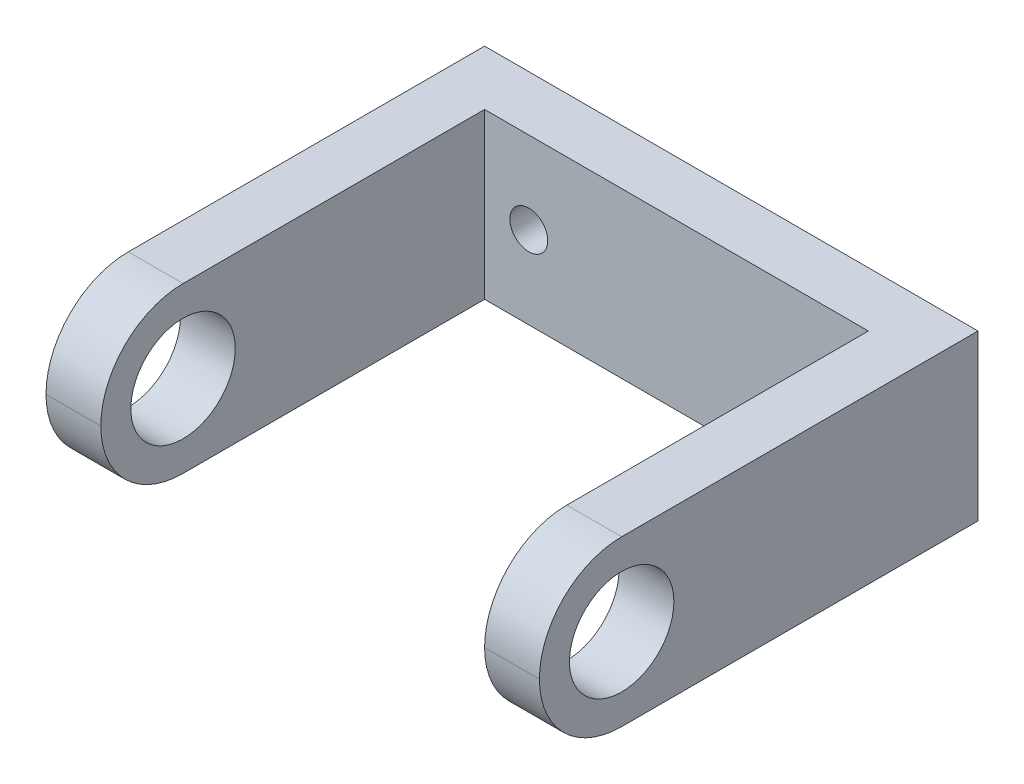
ISO-10303-21;
HEADER;
FILE_DESCRIPTION(('STEP AP214'),'2;1');
FILE_NAME('part.step','',(''),(''),'','','');
FILE_SCHEMA(('AUTOMOTIVE_DESIGN { 1 0 10303 214 1 1 1 1 }'));
ENDSEC;
DATA;
#1=APPLICATION_CONTEXT('core data for automotive mechanical design processes');
#2=APPLICATION_PROTOCOL_DEFINITION('international standard','automotive_design',2000,#1);
#3=PRODUCT_CONTEXT('',#1,'mechanical');
#4=PRODUCT('Part','Part','',(#3));
#5=PRODUCT_RELATED_PRODUCT_CATEGORY('part','',(#4));
#6=PRODUCT_DEFINITION_FORMATION('','',#4);
#7=PRODUCT_DEFINITION_CONTEXT('part definition',#1,'design');
#8=PRODUCT_DEFINITION('design','',#6,#7);
#9=PRODUCT_DEFINITION_SHAPE('','',#8);
#10=(LENGTH_UNIT() NAMED_UNIT(*) SI_UNIT(.MILLI.,.METRE.));
#11=(NAMED_UNIT(*) PLANE_ANGLE_UNIT() SI_UNIT($,.RADIAN.));
#12=(NAMED_UNIT(*) SI_UNIT($,.STERADIAN.) SOLID_ANGLE_UNIT());
#13=UNCERTAINTY_MEASURE_WITH_UNIT(LENGTH_MEASURE(1.E-05),#10,'distance_accuracy_value','');
#14=(GEOMETRIC_REPRESENTATION_CONTEXT(3) GLOBAL_UNCERTAINTY_ASSIGNED_CONTEXT((#13)) GLOBAL_UNIT_ASSIGNED_CONTEXT((#10,
#11,#12)) REPRESENTATION_CONTEXT('',''));
#15=CARTESIAN_POINT('',(0.,0.,0.));
#16=DIRECTION('',(0.,0.,1.));
#17=DIRECTION('',(1.,0.,0.));
#18=AXIS2_PLACEMENT_3D('',#15,#16,#17);
#19=CARTESIAN_POINT('',(-17.5,7.5,-27.5));
#20=DIRECTION('',(-1.,0.,0.));
#21=DIRECTION('',(0.,0.,1.));
#22=AXIS2_PLACEMENT_3D('',#19,#20,#21);
#23=PLANE('',#22);
#24=CARTESIAN_POINT('',(-17.5,0.,0.));
#25=DIRECTION('',(-1.,0.,0.));
#26=DIRECTION('',(0.,0.,1.));
#27=AXIS2_PLACEMENT_3D('',#24,#25,#26);
#28=CIRCLE('',#27,4.7625);
#29=CARTESIAN_POINT('',(-17.5,0.,-4.7625));
#30=VERTEX_POINT('',#29);
#31=EDGE_CURVE('E237',#30,#30,#28,.T.);
#32=ORIENTED_EDGE('',*,*,#31,.T.);
#33=EDGE_LOOP('',(#32));
#34=FACE_BOUND('',#33,.T.);
#35=CARTESIAN_POINT('',(-17.5,0.,0.));
#36=DIRECTION('',(-1.,0.,0.));
#37=DIRECTION('',(0.,0.,1.));
#38=AXIS2_PLACEMENT_3D('',#35,#36,#37);
#39=CIRCLE('',#38,7.5);
#40=CARTESIAN_POINT('',(-17.5,7.5,0.));
#41=VERTEX_POINT('',#40);
#42=CARTESIAN_POINT('',(-17.5,0.,7.5));
#43=VERTEX_POINT('',#42);
#44=EDGE_CURVE('E72',#41,#43,#39,.F.);
#45=ORIENTED_EDGE('',*,*,#44,.T.);
#46=CARTESIAN_POINT('',(-17.5,0.,0.));
#47=DIRECTION('',(-1.,0.,0.));
#48=DIRECTION('',(0.,0.,1.));
#49=AXIS2_PLACEMENT_3D('',#46,#47,#48);
#50=CIRCLE('',#49,7.5);
#51=CARTESIAN_POINT('',(-17.5,-7.5,0.));
#52=VERTEX_POINT('',#51);
#53=EDGE_CURVE('E198',#43,#52,#50,.F.);
#54=ORIENTED_EDGE('',*,*,#53,.T.);
#55=DIRECTION('',(0.,0.,-1.));
#56=VECTOR('',#55,1.);
#57=CARTESIAN_POINT('',(-17.5,-7.5,-27.5));
#58=LINE('',#57,#56);
#59=CARTESIAN_POINT('',(-17.5,-7.5,-27.5));
#60=VERTEX_POINT('',#59);
#61=EDGE_CURVE('E162',#52,#60,#58,.T.);
#62=ORIENTED_EDGE('',*,*,#61,.T.);
#63=DIRECTION('',(0.,-1.,0.));
#64=VECTOR('',#63,1.);
#65=CARTESIAN_POINT('',(-17.5,7.5,-27.5));
#66=LINE('',#65,#64);
#67=CARTESIAN_POINT('',(-17.5,7.5,-27.5));
#68=VERTEX_POINT('',#67);
#69=EDGE_CURVE('E154',#68,#60,#66,.T.);
#70=ORIENTED_EDGE('',*,*,#69,.F.);
#71=DIRECTION('',(0.,0.,-1.));
#72=VECTOR('',#71,1.);
#73=CARTESIAN_POINT('',(-17.5,7.5,-27.5));
#74=LINE('',#73,#72);
#75=EDGE_CURVE('E138',#41,#68,#74,.T.);
#76=ORIENTED_EDGE('',*,*,#75,.F.);
#77=EDGE_LOOP('',(#45,#54,#62,#70,#76));
#78=FACE_BOUND('',#77,.T.);
#79=ADVANCED_FACE('F42',(#34,#78),#23,.F.);
#80=CARTESIAN_POINT('',(17.5,7.5,-27.5));
#81=DIRECTION('',(0.,0.,-1.));
#82=DIRECTION('',(-1.,0.,0.));
#83=AXIS2_PLACEMENT_3D('',#80,#81,#82);
#84=PLANE('',#83);
#85=CARTESIAN_POINT('',(-13.47,0.,-27.5));
#86=DIRECTION('',(0.,0.,1.));
#87=DIRECTION('',(1.,0.,0.));
#88=AXIS2_PLACEMENT_3D('',#85,#86,#87);
#89=CIRCLE('',#88,1.7272);
#90=CARTESIAN_POINT('',(-11.7428,0.,-27.5));
#91=VERTEX_POINT('',#90);
#92=EDGE_CURVE('E222',#91,#91,#89,.T.);
#93=ORIENTED_EDGE('',*,*,#92,.F.);
#94=EDGE_LOOP('',(#93));
#95=FACE_BOUND('',#94,.T.);
#96=DIRECTION('',(1.,0.,0.));
#97=VECTOR('',#96,1.);
#98=CARTESIAN_POINT('',(17.5,-7.5,-27.5));
#99=LINE('',#98,#97);
#100=CARTESIAN_POINT('',(17.5,-7.5,-27.5));
#101=VERTEX_POINT('',#100);
#102=EDGE_CURVE('E253',#60,#101,#99,.T.);
#103=ORIENTED_EDGE('',*,*,#102,.T.);
#104=DIRECTION('',(0.,-1.,0.));
#105=VECTOR('',#104,1.);
#106=CARTESIAN_POINT('',(17.5,7.5,-27.5));
#107=LINE('',#106,#105);
#108=CARTESIAN_POINT('',(17.5,7.5,-27.5));
#109=VERTEX_POINT('',#108);
#110=EDGE_CURVE('E156',#109,#101,#107,.T.);
#111=ORIENTED_EDGE('',*,*,#110,.F.);
#112=DIRECTION('',(1.,0.,0.));
#113=VECTOR('',#112,1.);
#114=CARTESIAN_POINT('',(17.5,7.5,-27.5));
#115=LINE('',#114,#113);
#116=EDGE_CURVE('E142',#68,#109,#115,.T.);
#117=ORIENTED_EDGE('',*,*,#116,.F.);
#118=ORIENTED_EDGE('',*,*,#69,.T.);
#119=EDGE_LOOP('',(#103,#111,#117,#118));
#120=FACE_BOUND('',#119,.T.);
#121=ADVANCED_FACE('F153',(#95,#120),#84,.F.);
#122=CARTESIAN_POINT('',(17.5,7.5,7.5));
#123=DIRECTION('',(1.,0.,0.));
#124=DIRECTION('',(0.,0.,-1.));
#125=AXIS2_PLACEMENT_3D('',#122,#123,#124);
#126=PLANE('',#125);
#127=CARTESIAN_POINT('',(17.5,0.,0.));
#128=DIRECTION('',(1.,0.,0.));
#129=DIRECTION('',(0.,0.,-1.));
#130=AXIS2_PLACEMENT_3D('',#127,#128,#129);
#131=CIRCLE('',#130,4.7625);
#132=CARTESIAN_POINT('',(17.5,0.,-4.7625));
#133=VERTEX_POINT('',#132);
#134=EDGE_CURVE('E233',#133,#133,#131,.T.);
#135=ORIENTED_EDGE('',*,*,#134,.T.);
#136=EDGE_LOOP('',(#135));
#137=FACE_BOUND('',#136,.T.);
#138=CARTESIAN_POINT('',(17.5,0.,0.));
#139=DIRECTION('',(1.,0.,0.));
#140=DIRECTION('',(0.,0.,-1.));
#141=AXIS2_PLACEMENT_3D('',#138,#139,#140);
#142=CIRCLE('',#141,7.5);
#143=CARTESIAN_POINT('',(17.5,-7.5,0.));
#144=VERTEX_POINT('',#143);
#145=CARTESIAN_POINT('',(17.5,0.,7.5));
#146=VERTEX_POINT('',#145);
#147=EDGE_CURVE('E183',#144,#146,#142,.F.);
#148=ORIENTED_EDGE('',*,*,#147,.T.);
#149=CARTESIAN_POINT('',(17.5,0.,0.));
#150=DIRECTION('',(1.,0.,0.));
#151=DIRECTION('',(0.,0.,-1.));
#152=AXIS2_PLACEMENT_3D('',#149,#150,#151);
#153=CIRCLE('',#152,7.5);
#154=CARTESIAN_POINT('',(17.5,7.5,0.));
#155=VERTEX_POINT('',#154);
#156=EDGE_CURVE('E186',#146,#155,#153,.F.);
#157=ORIENTED_EDGE('',*,*,#156,.T.);
#158=DIRECTION('',(0.,0.,1.));
#159=VECTOR('',#158,1.);
#160=CARTESIAN_POINT('',(17.5,7.5,7.5));
#161=LINE('',#160,#159);
#162=EDGE_CURVE('E159',#109,#155,#161,.T.);
#163=ORIENTED_EDGE('',*,*,#162,.F.);
#164=ORIENTED_EDGE('',*,*,#110,.T.);
#165=DIRECTION('',(0.,0.,1.));
#166=VECTOR('',#165,1.);
#167=CARTESIAN_POINT('',(17.5,-7.5,7.5));
#168=LINE('',#167,#166);
#169=EDGE_CURVE('E256',#101,#144,#168,.T.);
#170=ORIENTED_EDGE('',*,*,#169,.T.);
#171=EDGE_LOOP('',(#148,#157,#163,#164,#170));
#172=FACE_BOUND('',#171,.T.);
#173=ADVANCED_FACE('F292',(#137,#172),#126,.F.);
#174=CARTESIAN_POINT('',(22.5,7.5,-32.5));
#175=DIRECTION('',(-1.,0.,0.));
#176=DIRECTION('',(0.,0.,1.));
#177=AXIS2_PLACEMENT_3D('',#174,#175,#176);
#178=PLANE('',#177);
#179=CARTESIAN_POINT('',(22.5,0.,0.));
#180=DIRECTION('',(1.,0.,0.));
#181=DIRECTION('',(0.,0.,-1.));
#182=AXIS2_PLACEMENT_3D('',#179,#180,#181);
#183=CIRCLE('',#182,4.7625);
#184=CARTESIAN_POINT('',(22.5,0.,-4.7625));
#185=VERTEX_POINT('',#184);
#186=EDGE_CURVE('E205',#185,#185,#183,.T.);
#187=ORIENTED_EDGE('',*,*,#186,.F.);
#188=EDGE_LOOP('',(#187));
#189=FACE_BOUND('',#188,.T.);
#190=DIRECTION('',(0.,0.,-1.));
#191=VECTOR('',#190,1.);
#192=CARTESIAN_POINT('',(22.5,7.5,-32.5));
#193=LINE('',#192,#191);
#194=CARTESIAN_POINT('',(22.5,7.5,0.));
#195=VERTEX_POINT('',#194);
#196=CARTESIAN_POINT('',(22.5,7.5,-32.5));
#197=VERTEX_POINT('',#196);
#198=EDGE_CURVE('E243',#195,#197,#193,.T.);
#199=ORIENTED_EDGE('',*,*,#198,.F.);
#200=CARTESIAN_POINT('',(22.5,0.,0.));
#201=DIRECTION('',(-1.,0.,0.));
#202=DIRECTION('',(0.,0.,1.));
#203=AXIS2_PLACEMENT_3D('',#200,#201,#202);
#204=CIRCLE('',#203,7.5);
#205=CARTESIAN_POINT('',(22.5,0.,7.5));
#206=VERTEX_POINT('',#205);
#207=EDGE_CURVE('E180',#195,#206,#204,.F.);
#208=ORIENTED_EDGE('',*,*,#207,.T.);
#209=CARTESIAN_POINT('',(22.5,0.,0.));
#210=DIRECTION('',(-1.,0.,0.));
#211=DIRECTION('',(0.,0.,1.));
#212=AXIS2_PLACEMENT_3D('',#209,#210,#211);
#213=CIRCLE('',#212,7.5);
#214=CARTESIAN_POINT('',(22.5,-7.5,0.));
#215=VERTEX_POINT('',#214);
#216=EDGE_CURVE('E177',#206,#215,#213,.F.);
#217=ORIENTED_EDGE('',*,*,#216,.T.);
#218=DIRECTION('',(0.,0.,-1.));
#219=VECTOR('',#218,1.);
#220=CARTESIAN_POINT('',(22.5,-7.5,-32.5));
#221=LINE('',#220,#219);
#222=CARTESIAN_POINT('',(22.5,-7.5,-32.5));
#223=VERTEX_POINT('',#222);
#224=EDGE_CURVE('E260',#215,#223,#221,.T.);
#225=ORIENTED_EDGE('',*,*,#224,.T.);
#226=DIRECTION('',(0.,-1.,0.));
#227=VECTOR('',#226,1.);
#228=CARTESIAN_POINT('',(22.5,7.5,-32.5));
#229=LINE('',#228,#227);
#230=EDGE_CURVE('E170',#197,#223,#229,.T.);
#231=ORIENTED_EDGE('',*,*,#230,.F.);
#232=EDGE_LOOP('',(#199,#208,#217,#225,#231));
#233=FACE_BOUND('',#232,.T.);
#234=ADVANCED_FACE('F297',(#189,#233),#178,.F.);
#235=CARTESIAN_POINT('',(-22.5,7.5,-32.5));
#236=DIRECTION('',(0.,0.,1.));
#237=DIRECTION('',(1.,0.,0.));
#238=AXIS2_PLACEMENT_3D('',#235,#236,#237);
#239=PLANE('',#238);
#240=CARTESIAN_POINT('',(-13.47,0.,-32.5));
#241=DIRECTION('',(0.,0.,1.));
#242=DIRECTION('',(1.,0.,0.));
#243=AXIS2_PLACEMENT_3D('',#240,#241,#242);
#244=CIRCLE('',#243,1.7272);
#245=CARTESIAN_POINT('',(-11.7428,0.,-32.5));
#246=VERTEX_POINT('',#245);
#247=EDGE_CURVE('E216',#246,#246,#244,.T.);
#248=ORIENTED_EDGE('',*,*,#247,.T.);
#249=EDGE_LOOP('',(#248));
#250=FACE_BOUND('',#249,.T.);
#251=DIRECTION('',(-1.,0.,0.));
#252=VECTOR('',#251,1.);
#253=CARTESIAN_POINT('',(-22.5,-7.5,-32.5));
#254=LINE('',#253,#252);
#255=CARTESIAN_POINT('',(-22.5,-7.5,-32.5));
#256=VERTEX_POINT('',#255);
#257=EDGE_CURVE('E263',#223,#256,#254,.T.);
#258=ORIENTED_EDGE('',*,*,#257,.T.);
#259=DIRECTION('',(0.,-1.,0.));
#260=VECTOR('',#259,1.);
#261=CARTESIAN_POINT('',(-22.5,7.5,-32.5));
#262=LINE('',#261,#260);
#263=CARTESIAN_POINT('',(-22.5,7.5,-32.5));
#264=VERTEX_POINT('',#263);
#265=EDGE_CURVE('E250',#264,#256,#262,.T.);
#266=ORIENTED_EDGE('',*,*,#265,.F.);
#267=DIRECTION('',(-1.,0.,0.));
#268=VECTOR('',#267,1.);
#269=CARTESIAN_POINT('',(-22.5,7.5,-32.5));
#270=LINE('',#269,#268);
#271=EDGE_CURVE('E245',#197,#264,#270,.T.);
#272=ORIENTED_EDGE('',*,*,#271,.F.);
#273=ORIENTED_EDGE('',*,*,#230,.T.);
#274=EDGE_LOOP('',(#258,#266,#272,#273));
#275=FACE_BOUND('',#274,.T.);
#276=ADVANCED_FACE('F276',(#250,#275),#239,.F.);
#277=CARTESIAN_POINT('',(-22.5,7.5,7.5));
#278=DIRECTION('',(1.,0.,0.));
#279=DIRECTION('',(0.,0.,-1.));
#280=AXIS2_PLACEMENT_3D('',#277,#278,#279);
#281=PLANE('',#280);
#282=CARTESIAN_POINT('',(-22.5,0.,0.));
#283=DIRECTION('',(1.,0.,0.));
#284=DIRECTION('',(0.,0.,-1.));
#285=AXIS2_PLACEMENT_3D('',#282,#283,#284);
#286=CIRCLE('',#285,4.7625);
#287=CARTESIAN_POINT('',(-22.5,0.,-4.7625));
#288=VERTEX_POINT('',#287);
#289=EDGE_CURVE('E212',#288,#288,#286,.T.);
#290=ORIENTED_EDGE('',*,*,#289,.T.);
#291=EDGE_LOOP('',(#290));
#292=FACE_BOUND('',#291,.T.);
#293=DIRECTION('',(0.,0.,1.));
#294=VECTOR('',#293,1.);
#295=CARTESIAN_POINT('',(-22.5,-7.5,7.5));
#296=LINE('',#295,#294);
#297=CARTESIAN_POINT('',(-22.5,-7.5,0.));
#298=VERTEX_POINT('',#297);
#299=EDGE_CURVE('E149',#256,#298,#296,.T.);
#300=ORIENTED_EDGE('',*,*,#299,.T.);
#301=CARTESIAN_POINT('',(-22.5,0.,0.));
#302=DIRECTION('',(1.,0.,0.));
#303=DIRECTION('',(0.,0.,-1.));
#304=AXIS2_PLACEMENT_3D('',#301,#302,#303);
#305=CIRCLE('',#304,7.5);
#306=CARTESIAN_POINT('',(-22.5,0.,7.5));
#307=VERTEX_POINT('',#306);
#308=EDGE_CURVE('E11',#298,#307,#305,.F.);
#309=ORIENTED_EDGE('',*,*,#308,.T.);
#310=CARTESIAN_POINT('',(-22.5,0.,0.));
#311=DIRECTION('',(1.,0.,0.));
#312=DIRECTION('',(0.,0.,-1.));
#313=AXIS2_PLACEMENT_3D('',#310,#311,#312);
#314=CIRCLE('',#313,7.5);
#315=CARTESIAN_POINT('',(-22.5,7.5,0.));
#316=VERTEX_POINT('',#315);
#317=EDGE_CURVE('E52',#307,#316,#314,.F.);
#318=ORIENTED_EDGE('',*,*,#317,.T.);
#319=DIRECTION('',(0.,0.,1.));
#320=VECTOR('',#319,1.);
#321=CARTESIAN_POINT('',(-22.5,7.5,7.5));
#322=LINE('',#321,#320);
#323=EDGE_CURVE('E248',#264,#316,#322,.T.);
#324=ORIENTED_EDGE('',*,*,#323,.F.);
#325=ORIENTED_EDGE('',*,*,#265,.T.);
#326=EDGE_LOOP('',(#300,#309,#318,#324,#325));
#327=FACE_BOUND('',#326,.T.);
#328=ADVANCED_FACE('F286',(#292,#327),#281,.F.);
#329=CARTESIAN_POINT('',(0.,7.5,0.));
#330=DIRECTION('',(0.,-1.,0.));
#331=DIRECTION('',(0.,0.,-1.));
#332=AXIS2_PLACEMENT_3D('',#329,#330,#331);
#333=PLANE('',#332);
#334=ORIENTED_EDGE('',*,*,#162,.T.);
#335=DIRECTION('',(1.,0.,0.));
#336=VECTOR('',#335,1.);
#337=CARTESIAN_POINT('',(0.,7.5,0.));
#338=LINE('',#337,#336);
#339=EDGE_CURVE('E167',#155,#195,#338,.T.);
#340=ORIENTED_EDGE('',*,*,#339,.T.);
#341=ORIENTED_EDGE('',*,*,#198,.T.);
#342=ORIENTED_EDGE('',*,*,#271,.T.);
#343=ORIENTED_EDGE('',*,*,#323,.T.);
#344=DIRECTION('',(1.,0.,0.));
#345=VECTOR('',#344,1.);
#346=CARTESIAN_POINT('',(0.,7.5,0.));
#347=LINE('',#346,#345);
#348=EDGE_CURVE('E146',#316,#41,#347,.T.);
#349=ORIENTED_EDGE('',*,*,#348,.T.);
#350=ORIENTED_EDGE('',*,*,#75,.T.);
#351=ORIENTED_EDGE('',*,*,#116,.T.);
#352=EDGE_LOOP('',(#334,#340,#341,#342,#343,#349,#350,#351));
#353=FACE_BOUND('',#352,.T.);
#354=ADVANCED_FACE('F141',(#353),#333,.F.);
#355=CARTESIAN_POINT('',(0.,-7.5,0.));
#356=DIRECTION('',(0.,-1.,0.));
#357=DIRECTION('',(0.,0.,-1.));
#358=AXIS2_PLACEMENT_3D('',#355,#356,#357);
#359=PLANE('',#358);
#360=ORIENTED_EDGE('',*,*,#224,.F.);
#361=DIRECTION('',(1.,0.,0.));
#362=VECTOR('',#361,1.);
#363=CARTESIAN_POINT('',(17.5,-7.5,0.));
#364=LINE('',#363,#362);
#365=EDGE_CURVE('E193',#215,#144,#364,.F.);
#366=ORIENTED_EDGE('',*,*,#365,.T.);
#367=ORIENTED_EDGE('',*,*,#169,.F.);
#368=ORIENTED_EDGE('',*,*,#102,.F.);
#369=ORIENTED_EDGE('',*,*,#61,.F.);
#370=DIRECTION('',(1.,0.,0.));
#371=VECTOR('',#370,1.);
#372=CARTESIAN_POINT('',(-22.5,-7.5,0.));
#373=LINE('',#372,#371);
#374=EDGE_CURVE('E189',#52,#298,#373,.F.);
#375=ORIENTED_EDGE('',*,*,#374,.T.);
#376=ORIENTED_EDGE('',*,*,#299,.F.);
#377=ORIENTED_EDGE('',*,*,#257,.F.);
#378=EDGE_LOOP('',(#360,#366,#367,#368,#369,#375,#376,#377));
#379=FACE_BOUND('',#378,.T.);
#380=ADVANCED_FACE('F283',(#379),#359,.T.);
#381=CARTESIAN_POINT('',(-22.5,0.,0.));
#382=DIRECTION('',(1.,0.,0.));
#383=DIRECTION('',(0.,0.,-1.));
#384=AXIS2_PLACEMENT_3D('',#381,#382,#383);
#385=CYLINDRICAL_SURFACE('',#384,4.7625);
#386=CARTESIAN_POINT('',(-22.5,0.,-4.7625));
#387=CARTESIAN_POINT('',(-22.4479166666667,0.,-4.7625));
#388=CARTESIAN_POINT('',(-22.3958333333333,0.,-4.7625));
#389=CARTESIAN_POINT('',(-22.2916666666667,0.,-4.7625));
#390=CARTESIAN_POINT('',(-22.2395833333333,0.,-4.7625));
#391=CARTESIAN_POINT('',(-22.1354166666667,0.,-4.7625));
#392=CARTESIAN_POINT('',(-22.0833333333333,0.,-4.7625));
#393=CARTESIAN_POINT('',(-21.9791666666667,0.,-4.7625));
#394=CARTESIAN_POINT('',(-21.9270833333333,0.,-4.7625));
#395=CARTESIAN_POINT('',(-21.8229166666667,0.,-4.7625));
#396=CARTESIAN_POINT('',(-21.7708333333333,0.,-4.7625));
#397=CARTESIAN_POINT('',(-21.6666666666667,0.,-4.7625));
#398=CARTESIAN_POINT('',(-21.6145833333333,0.,-4.7625));
#399=CARTESIAN_POINT('',(-21.5104166666667,0.,-4.7625));
#400=CARTESIAN_POINT('',(-21.4583333333333,0.,-4.7625));
#401=CARTESIAN_POINT('',(-21.3541666666667,0.,-4.7625));
#402=CARTESIAN_POINT('',(-21.3020833333333,0.,-4.7625));
#403=CARTESIAN_POINT('',(-21.1979166666667,0.,-4.7625));
#404=CARTESIAN_POINT('',(-21.1458333333333,0.,-4.7625));
#405=CARTESIAN_POINT('',(-21.0416666666667,0.,-4.7625));
#406=CARTESIAN_POINT('',(-20.9895833333333,0.,-4.7625));
#407=CARTESIAN_POINT('',(-20.8854166666667,0.,-4.7625));
#408=CARTESIAN_POINT('',(-20.8333333333333,0.,-4.7625));
#409=CARTESIAN_POINT('',(-20.7291666666667,0.,-4.7625));
#410=CARTESIAN_POINT('',(-20.6770833333333,0.,-4.7625));
#411=CARTESIAN_POINT('',(-20.5729166666667,0.,-4.7625));
#412=CARTESIAN_POINT('',(-20.5208333333333,0.,-4.7625));
#413=CARTESIAN_POINT('',(-20.4166666666667,0.,-4.7625));
#414=CARTESIAN_POINT('',(-20.3645833333333,0.,-4.7625));
#415=CARTESIAN_POINT('',(-20.2604166666667,0.,-4.7625));
#416=CARTESIAN_POINT('',(-20.2083333333333,0.,-4.7625));
#417=CARTESIAN_POINT('',(-20.1041666666667,0.,-4.7625));
#418=CARTESIAN_POINT('',(-20.0520833333333,0.,-4.7625));
#419=CARTESIAN_POINT('',(-19.9479166666667,0.,-4.7625));
#420=CARTESIAN_POINT('',(-19.8958333333333,0.,-4.7625));
#421=CARTESIAN_POINT('',(-19.7916666666667,0.,-4.7625));
#422=CARTESIAN_POINT('',(-19.7395833333333,0.,-4.7625));
#423=CARTESIAN_POINT('',(-19.6354166666667,0.,-4.7625));
#424=CARTESIAN_POINT('',(-19.5833333333333,0.,-4.7625));
#425=CARTESIAN_POINT('',(-19.4791666666667,0.,-4.7625));
#426=CARTESIAN_POINT('',(-19.4270833333333,0.,-4.7625));
#427=CARTESIAN_POINT('',(-19.3229166666667,0.,-4.7625));
#428=CARTESIAN_POINT('',(-19.2708333333333,0.,-4.7625));
#429=CARTESIAN_POINT('',(-19.1666666666667,0.,-4.7625));
#430=CARTESIAN_POINT('',(-19.1145833333333,0.,-4.7625));
#431=CARTESIAN_POINT('',(-19.0104166666667,0.,-4.7625));
#432=CARTESIAN_POINT('',(-18.9583333333333,0.,-4.7625));
#433=CARTESIAN_POINT('',(-18.8541666666667,0.,-4.7625));
#434=CARTESIAN_POINT('',(-18.8020833333333,0.,-4.7625));
#435=CARTESIAN_POINT('',(-18.6979166666667,0.,-4.7625));
#436=CARTESIAN_POINT('',(-18.6458333333333,0.,-4.7625));
#437=CARTESIAN_POINT('',(-18.5416666666667,0.,-4.7625));
#438=CARTESIAN_POINT('',(-18.4895833333333,0.,-4.7625));
#439=CARTESIAN_POINT('',(-18.3854166666667,0.,-4.7625));
#440=CARTESIAN_POINT('',(-18.3333333333333,0.,-4.7625));
#441=CARTESIAN_POINT('',(-18.2291666666667,0.,-4.7625));
#442=CARTESIAN_POINT('',(-18.1770833333333,0.,-4.7625));
#443=CARTESIAN_POINT('',(-18.0729166666667,0.,-4.7625));
#444=CARTESIAN_POINT('',(-18.0208333333333,0.,-4.7625));
#445=CARTESIAN_POINT('',(-17.9166666666667,0.,-4.7625));
#446=CARTESIAN_POINT('',(-17.8645833333333,0.,-4.7625));
#447=CARTESIAN_POINT('',(-17.7604166666667,0.,-4.7625));
#448=CARTESIAN_POINT('',(-17.7083333333333,0.,-4.7625));
#449=CARTESIAN_POINT('',(-17.6041666666667,0.,-4.7625));
#450=CARTESIAN_POINT('',(-17.5520833333333,0.,-4.7625));
#451=CARTESIAN_POINT('',(-17.5,0.,-4.7625));
#452=B_SPLINE_CURVE_WITH_KNOTS('',3,(#386,#387,#388,#389,#390,#391,#392,#393,#394,#395,#396,
#397,#398,#399,#400,#401,#402,#403,#404,#405,#406,#407,#408,#409,#410,#411,#412,#413,#414,#415,
#416,#417,#418,#419,#420,#421,#422,#423,#424,#425,#426,#427,#428,#429,#430,#431,#432,#433,#434,
#435,#436,#437,#438,#439,#440,#441,#442,#443,#444,#445,#446,#447,#448,#449,#450,#451),
.UNSPECIFIED.,.F.,.F.,(4,2,2,2,2,2,2,2,2,2,2,2,2,2,2,2,2,2,2,2,2,2,2,2,2,2,2,2,2,2,2,2,4),(0.,
0.15625,0.3125,0.46875,0.625000000000001,0.781250000000001,0.937500000000001,1.09375,1.25,
1.40625,1.5625,1.71875,1.875,2.03125,2.1875,2.34375,2.5,2.65625,2.8125,2.96875,3.125,3.28125,
3.4375,3.59375,3.75,3.90625,4.0625,4.21875,4.375,4.53125,4.6875,4.84375,5.),.UNSPECIFIED.);
#453=EDGE_CURVE('BSEAM308',#288,#30,#452,.T.);
#454=ORIENTED_EDGE('',*,*,#289,.F.);
#455=ORIENTED_EDGE('',*,*,#31,.F.);
#456=ORIENTED_EDGE('',*,*,#453,.T.);
#457=ORIENTED_EDGE('',*,*,#453,.F.);
#458=EDGE_LOOP('',(#454,#456,#455,#457));
#459=FACE_BOUND('',#458,.T.);
#460=ADVANCED_FACE('F308',(#459),#385,.F.);
#461=CARTESIAN_POINT('',(22.5,0.,-4.7625));
#462=CARTESIAN_POINT('',(22.4479166666667,0.,-4.7625));
#463=CARTESIAN_POINT('',(22.3958333333333,0.,-4.7625));
#464=CARTESIAN_POINT('',(22.2916666666667,0.,-4.7625));
#465=CARTESIAN_POINT('',(22.2395833333333,0.,-4.7625));
#466=CARTESIAN_POINT('',(22.1354166666667,0.,-4.7625));
#467=CARTESIAN_POINT('',(22.0833333333333,0.,-4.7625));
#468=CARTESIAN_POINT('',(21.9791666666667,0.,-4.7625));
#469=CARTESIAN_POINT('',(21.9270833333333,0.,-4.7625));
#470=CARTESIAN_POINT('',(21.8229166666667,0.,-4.7625));
#471=CARTESIAN_POINT('',(21.7708333333333,0.,-4.7625));
#472=CARTESIAN_POINT('',(21.6666666666667,0.,-4.7625));
#473=CARTESIAN_POINT('',(21.6145833333333,0.,-4.7625));
#474=CARTESIAN_POINT('',(21.5104166666667,0.,-4.7625));
#475=CARTESIAN_POINT('',(21.4583333333333,0.,-4.7625));
#476=CARTESIAN_POINT('',(21.3541666666667,0.,-4.7625));
#477=CARTESIAN_POINT('',(21.3020833333333,0.,-4.7625));
#478=CARTESIAN_POINT('',(21.1979166666667,0.,-4.7625));
#479=CARTESIAN_POINT('',(21.1458333333333,0.,-4.7625));
#480=CARTESIAN_POINT('',(21.0416666666667,0.,-4.7625));
#481=CARTESIAN_POINT('',(20.9895833333333,0.,-4.7625));
#482=CARTESIAN_POINT('',(20.8854166666667,0.,-4.7625));
#483=CARTESIAN_POINT('',(20.8333333333333,0.,-4.7625));
#484=CARTESIAN_POINT('',(20.7291666666667,0.,-4.7625));
#485=CARTESIAN_POINT('',(20.6770833333333,0.,-4.7625));
#486=CARTESIAN_POINT('',(20.5729166666667,0.,-4.7625));
#487=CARTESIAN_POINT('',(20.5208333333333,0.,-4.7625));
#488=CARTESIAN_POINT('',(20.4166666666667,0.,-4.7625));
#489=CARTESIAN_POINT('',(20.3645833333333,0.,-4.7625));
#490=CARTESIAN_POINT('',(20.2604166666667,0.,-4.7625));
#491=CARTESIAN_POINT('',(20.2083333333333,0.,-4.7625));
#492=CARTESIAN_POINT('',(20.1041666666667,0.,-4.7625));
#493=CARTESIAN_POINT('',(20.0520833333333,0.,-4.7625));
#494=CARTESIAN_POINT('',(19.9479166666667,0.,-4.7625));
#495=CARTESIAN_POINT('',(19.8958333333333,0.,-4.7625));
#496=CARTESIAN_POINT('',(19.7916666666667,0.,-4.7625));
#497=CARTESIAN_POINT('',(19.7395833333333,0.,-4.7625));
#498=CARTESIAN_POINT('',(19.6354166666667,0.,-4.7625));
#499=CARTESIAN_POINT('',(19.5833333333333,0.,-4.7625));
#500=CARTESIAN_POINT('',(19.4791666666667,0.,-4.7625));
#501=CARTESIAN_POINT('',(19.4270833333333,0.,-4.7625));
#502=CARTESIAN_POINT('',(19.3229166666667,0.,-4.7625));
#503=CARTESIAN_POINT('',(19.2708333333333,0.,-4.7625));
#504=CARTESIAN_POINT('',(19.1666666666667,0.,-4.7625));
#505=CARTESIAN_POINT('',(19.1145833333333,0.,-4.7625));
#506=CARTESIAN_POINT('',(19.0104166666667,0.,-4.7625));
#507=CARTESIAN_POINT('',(18.9583333333333,0.,-4.7625));
#508=CARTESIAN_POINT('',(18.8541666666667,0.,-4.7625));
#509=CARTESIAN_POINT('',(18.8020833333333,0.,-4.7625));
#510=CARTESIAN_POINT('',(18.6979166666667,0.,-4.7625));
#511=CARTESIAN_POINT('',(18.6458333333333,0.,-4.7625));
#512=CARTESIAN_POINT('',(18.5416666666667,0.,-4.7625));
#513=CARTESIAN_POINT('',(18.4895833333333,0.,-4.7625));
#514=CARTESIAN_POINT('',(18.3854166666667,0.,-4.7625));
#515=CARTESIAN_POINT('',(18.3333333333333,0.,-4.7625));
#516=CARTESIAN_POINT('',(18.2291666666667,0.,-4.7625));
#517=CARTESIAN_POINT('',(18.1770833333333,0.,-4.7625));
#518=CARTESIAN_POINT('',(18.0729166666667,0.,-4.7625));
#519=CARTESIAN_POINT('',(18.0208333333333,0.,-4.7625));
#520=CARTESIAN_POINT('',(17.9166666666667,0.,-4.7625));
#521=CARTESIAN_POINT('',(17.8645833333333,0.,-4.7625));
#522=CARTESIAN_POINT('',(17.7604166666667,0.,-4.7625));
#523=CARTESIAN_POINT('',(17.7083333333333,0.,-4.7625));
#524=CARTESIAN_POINT('',(17.6041666666667,0.,-4.7625));
#525=CARTESIAN_POINT('',(17.5520833333333,0.,-4.7625));
#526=CARTESIAN_POINT('',(17.5,0.,-4.7625));
#527=B_SPLINE_CURVE_WITH_KNOTS('',3,(#461,#462,#463,#464,#465,#466,#467,#468,#469,#470,#471,
#472,#473,#474,#475,#476,#477,#478,#479,#480,#481,#482,#483,#484,#485,#486,#487,#488,#489,#490,
#491,#492,#493,#494,#495,#496,#497,#498,#499,#500,#501,#502,#503,#504,#505,#506,#507,#508,#509,
#510,#511,#512,#513,#514,#515,#516,#517,#518,#519,#520,#521,#522,#523,#524,#525,#526),
.UNSPECIFIED.,.F.,.F.,(4,2,2,2,2,2,2,2,2,2,2,2,2,2,2,2,2,2,2,2,2,2,2,2,2,2,2,2,2,2,2,2,4),(0.,
0.156249999999997,0.3125,0.468750000000004,0.625000000000001,0.781249999999997,
0.937500000000001,1.09375,1.25,1.40625,1.5625,1.71875,1.875,2.03125,2.1875,2.34375000000001,2.5,
2.65625,2.8125,2.96875000000001,3.125,3.28125,3.4375,3.59375000000001,3.75,3.90625,4.0625,
4.21875000000001,4.375,4.53125,4.6875,4.84375000000001,5.),.UNSPECIFIED.);
#528=EDGE_CURVE('BSEAM301',#185,#133,#527,.T.);
#529=ORIENTED_EDGE('',*,*,#186,.T.);
#530=ORIENTED_EDGE('',*,*,#134,.F.);
#531=ORIENTED_EDGE('',*,*,#528,.T.);
#532=ORIENTED_EDGE('',*,*,#528,.F.);
#533=EDGE_LOOP('',(#529,#531,#530,#532));
#534=FACE_BOUND('',#533,.T.);
#535=ADVANCED_FACE('F301',(#534),#385,.F.);
#536=CARTESIAN_POINT('',(22.5,0.,0.));
#537=DIRECTION('',(-1.,0.,0.));
#538=DIRECTION('',(0.,0.,1.));
#539=AXIS2_PLACEMENT_3D('',#536,#537,#538);
#540=CYLINDRICAL_SURFACE('',#539,7.5);
#541=DIRECTION('',(1.,0.,0.));
#542=VECTOR('',#541,1.);
#543=CARTESIAN_POINT('',(22.5,0.,7.5));
#544=LINE('',#543,#542);
#545=EDGE_CURVE('E202',#146,#206,#544,.T.);
#546=ORIENTED_EDGE('',*,*,#545,.F.);
#547=ORIENTED_EDGE('',*,*,#147,.F.);
#548=ORIENTED_EDGE('',*,*,#365,.F.);
#549=ORIENTED_EDGE('',*,*,#216,.F.);
#550=EDGE_LOOP('',(#546,#547,#548,#549));
#551=FACE_BOUND('',#550,.T.);
#552=ADVANCED_FACE('F299',(#551),#540,.T.);
#553=CARTESIAN_POINT('',(0.,0.,0.));
#554=DIRECTION('',(1.,0.,0.));
#555=DIRECTION('',(0.,0.,-1.));
#556=AXIS2_PLACEMENT_3D('',#553,#554,#555);
#557=CYLINDRICAL_SURFACE('',#556,7.5);
#558=ORIENTED_EDGE('',*,*,#156,.F.);
#559=ORIENTED_EDGE('',*,*,#545,.T.);
#560=ORIENTED_EDGE('',*,*,#207,.F.);
#561=ORIENTED_EDGE('',*,*,#339,.F.);
#562=EDGE_LOOP('',(#558,#559,#560,#561));
#563=FACE_BOUND('',#562,.T.);
#564=ADVANCED_FACE('F295',(#563),#557,.T.);
#565=CARTESIAN_POINT('',(0.,0.,0.));
#566=DIRECTION('',(1.,0.,0.));
#567=DIRECTION('',(0.,0.,-1.));
#568=AXIS2_PLACEMENT_3D('',#565,#566,#567);
#569=CYLINDRICAL_SURFACE('',#568,7.5);
#570=ORIENTED_EDGE('',*,*,#348,.F.);
#571=ORIENTED_EDGE('',*,*,#317,.F.);
#572=DIRECTION('',(1.,0.,0.));
#573=VECTOR('',#572,1.);
#574=CARTESIAN_POINT('',(-17.5,0.,7.5));
#575=LINE('',#574,#573);
#576=EDGE_CURVE('E46',#43,#307,#575,.F.);
#577=ORIENTED_EDGE('',*,*,#576,.F.);
#578=ORIENTED_EDGE('',*,*,#44,.F.);
#579=EDGE_LOOP('',(#570,#571,#577,#578));
#580=FACE_BOUND('',#579,.T.);
#581=ADVANCED_FACE('F44',(#580),#569,.T.);
#582=CARTESIAN_POINT('',(-17.5,0.,0.));
#583=DIRECTION('',(-1.,0.,0.));
#584=DIRECTION('',(0.,0.,1.));
#585=AXIS2_PLACEMENT_3D('',#582,#583,#584);
#586=CYLINDRICAL_SURFACE('',#585,7.5);
#587=ORIENTED_EDGE('',*,*,#308,.F.);
#588=ORIENTED_EDGE('',*,*,#374,.F.);
#589=ORIENTED_EDGE('',*,*,#53,.F.);
#590=ORIENTED_EDGE('',*,*,#576,.T.);
#591=EDGE_LOOP('',(#587,#588,#589,#590));
#592=FACE_BOUND('',#591,.T.);
#593=ADVANCED_FACE('F289',(#592),#586,.T.);
#594=CARTESIAN_POINT('',(-13.47,0.,-27.5));
#595=DIRECTION('',(0.,0.,1.));
#596=DIRECTION('',(1.,0.,0.));
#597=AXIS2_PLACEMENT_3D('',#594,#595,#596);
#598=CYLINDRICAL_SURFACE('',#597,1.7272);
#599=ORIENTED_EDGE('',*,*,#247,.F.);
#600=EDGE_LOOP('',(#599));
#601=FACE_BOUND('',#600,.T.);
#602=ORIENTED_EDGE('',*,*,#92,.T.);
#603=EDGE_LOOP('',(#602));
#604=FACE_BOUND('',#603,.T.);
#605=ADVANCED_FACE('F337',(#601,#604),#598,.F.);
#606=CLOSED_SHELL('',(#79,#121,#173,#234,#276,#328,#354,#380,#460,#535,#552,#564,#581,#593,#605));
#607=MANIFOLD_SOLID_BREP('B2',#606);
#608=ADVANCED_BREP_SHAPE_REPRESENTATION('',(#18,#607),#14);
#609=SHAPE_DEFINITION_REPRESENTATION(#9,#608);
ENDSEC;
END-ISO-10303-21;
